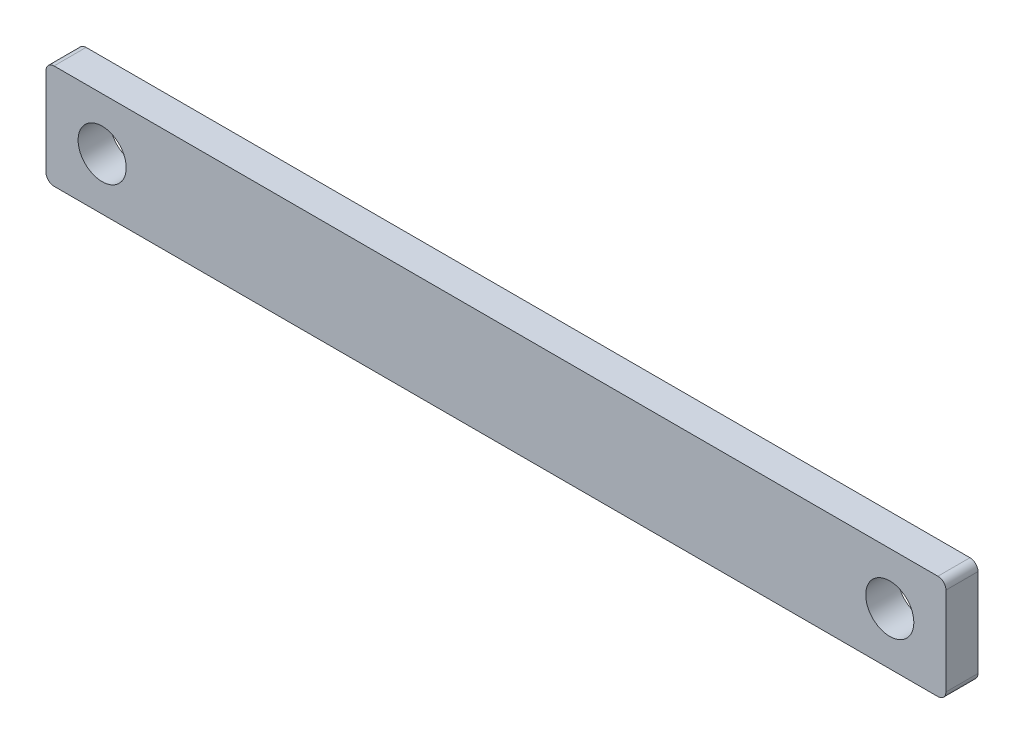
ISO-10303-21;
HEADER;
FILE_DESCRIPTION(('STEP AP214'),'2;1');
FILE_NAME('part.step','',(''),(''),'','','');
FILE_SCHEMA(('AUTOMOTIVE_DESIGN { 1 0 10303 214 1 1 1 1 }'));
ENDSEC;
DATA;
#1=APPLICATION_CONTEXT('core data for automotive mechanical design processes');
#2=APPLICATION_PROTOCOL_DEFINITION('international standard','automotive_design',2000,#1);
#3=PRODUCT_CONTEXT('',#1,'mechanical');
#4=PRODUCT('Part','Part','',(#3));
#5=PRODUCT_RELATED_PRODUCT_CATEGORY('part','',(#4));
#6=PRODUCT_DEFINITION_FORMATION('','',#4);
#7=PRODUCT_DEFINITION_CONTEXT('part definition',#1,'design');
#8=PRODUCT_DEFINITION('design','',#6,#7);
#9=PRODUCT_DEFINITION_SHAPE('','',#8);
#10=(LENGTH_UNIT() NAMED_UNIT(*) SI_UNIT(.MILLI.,.METRE.));
#11=(NAMED_UNIT(*) PLANE_ANGLE_UNIT() SI_UNIT($,.RADIAN.));
#12=(NAMED_UNIT(*) SI_UNIT($,.STERADIAN.) SOLID_ANGLE_UNIT());
#13=UNCERTAINTY_MEASURE_WITH_UNIT(LENGTH_MEASURE(1.E-05),#10,'distance_accuracy_value','');
#14=(GEOMETRIC_REPRESENTATION_CONTEXT(3) GLOBAL_UNCERTAINTY_ASSIGNED_CONTEXT((#13)) GLOBAL_UNIT_ASSIGNED_CONTEXT((#10,
#11,#12)) REPRESENTATION_CONTEXT('',''));
#15=CARTESIAN_POINT('',(0.,0.,0.));
#16=DIRECTION('',(0.,0.,1.));
#17=DIRECTION('',(1.,0.,0.));
#18=AXIS2_PLACEMENT_3D('',#15,#16,#17);
#19=CARTESIAN_POINT('',(1112.,120.,40.));
#20=DIRECTION('',(0.,0.,-1.));
#21=DIRECTION('',(-1.,0.,0.));
#22=AXIS2_PLACEMENT_3D('',#19,#20,#21);
#23=PLANE('',#22);
#24=CARTESIAN_POINT('',(1112.,120.,40.));
#25=DIRECTION('',(0.,0.,1.));
#26=DIRECTION('',(-1.,0.,0.));
#27=AXIS2_PLACEMENT_3D('',#24,#25,#26);
#28=CIRCLE('',#27,9.99999999999989);
#29=CARTESIAN_POINT('',(1122.,120.,40.));
#30=VERTEX_POINT('',#29);
#31=CARTESIAN_POINT('',(1112.,130.,40.));
#32=VERTEX_POINT('',#31);
#33=EDGE_CURVE('E144',#30,#32,#28,.T.);
#34=ORIENTED_EDGE('',*,*,#33,.T.);
#35=DIRECTION('',(-1.,0.,0.));
#36=VECTOR('',#35,1.);
#37=CARTESIAN_POINT('',(10.,130.,40.));
#38=LINE('',#37,#36);
#39=CARTESIAN_POINT('',(10.,130.,40.));
#40=VERTEX_POINT('',#39);
#41=EDGE_CURVE('E92',#32,#40,#38,.T.);
#42=ORIENTED_EDGE('',*,*,#41,.T.);
#43=CARTESIAN_POINT('',(10.,120.,40.));
#44=DIRECTION('',(0.,0.,1.));
#45=DIRECTION('',(-1.,0.,0.));
#46=AXIS2_PLACEMENT_3D('',#43,#44,#45);
#47=CIRCLE('',#46,10.);
#48=CARTESIAN_POINT('',(0.,120.,40.));
#49=VERTEX_POINT('',#48);
#50=EDGE_CURVE('E159',#40,#49,#47,.T.);
#51=ORIENTED_EDGE('',*,*,#50,.T.);
#52=DIRECTION('',(0.,-1.,0.));
#53=VECTOR('',#52,1.);
#54=CARTESIAN_POINT('',(0.,10.0000000000001,40.));
#55=LINE('',#54,#53);
#56=CARTESIAN_POINT('',(0.,10.0000000000001,40.));
#57=VERTEX_POINT('',#56);
#58=EDGE_CURVE('E172',#49,#57,#55,.T.);
#59=ORIENTED_EDGE('',*,*,#58,.T.);
#60=CARTESIAN_POINT('',(10.,10.,40.));
#61=DIRECTION('',(0.,0.,1.));
#62=DIRECTION('',(-1.,0.,0.));
#63=AXIS2_PLACEMENT_3D('',#60,#61,#62);
#64=CIRCLE('',#63,10.);
#65=CARTESIAN_POINT('',(10.0000000000001,0.,40.));
#66=VERTEX_POINT('',#65);
#67=EDGE_CURVE('E111',#57,#66,#64,.T.);
#68=ORIENTED_EDGE('',*,*,#67,.T.);
#69=DIRECTION('',(1.,0.,0.));
#70=VECTOR('',#69,1.);
#71=CARTESIAN_POINT('',(10.0000000000001,0.,40.));
#72=LINE('',#71,#70);
#73=CARTESIAN_POINT('',(1112.,0.,40.));
#74=VERTEX_POINT('',#73);
#75=EDGE_CURVE('E105',#66,#74,#72,.T.);
#76=ORIENTED_EDGE('',*,*,#75,.T.);
#77=CARTESIAN_POINT('',(1112.,10.,40.));
#78=DIRECTION('',(0.,0.,1.));
#79=DIRECTION('',(1.,0.,0.));
#80=AXIS2_PLACEMENT_3D('',#77,#78,#79);
#81=CIRCLE('',#80,10.);
#82=CARTESIAN_POINT('',(1122.,10.,40.));
#83=VERTEX_POINT('',#82);
#84=EDGE_CURVE('E109',#74,#83,#81,.T.);
#85=ORIENTED_EDGE('',*,*,#84,.T.);
#86=DIRECTION('',(0.,1.,0.));
#87=VECTOR('',#86,1.);
#88=CARTESIAN_POINT('',(1122.,10.,40.));
#89=LINE('',#88,#87);
#90=EDGE_CURVE('E49',#83,#30,#89,.T.);
#91=ORIENTED_EDGE('',*,*,#90,.T.);
#92=EDGE_LOOP('',(#34,#42,#51,#59,#68,#76,#85,#91));
#93=FACE_BOUND('',#92,.T.);
#94=CARTESIAN_POINT('',(70.,65.,40.));
#95=DIRECTION('',(0.,0.,1.));
#96=DIRECTION('',(1.,0.,0.));
#97=AXIS2_PLACEMENT_3D('',#94,#95,#96);
#98=CIRCLE('',#97,30.);
#99=CARTESIAN_POINT('',(100.,65.,40.));
#100=VERTEX_POINT('',#99);
#101=EDGE_CURVE('E133',#100,#100,#98,.T.);
#102=ORIENTED_EDGE('',*,*,#101,.F.);
#103=EDGE_LOOP('',(#102));
#104=FACE_BOUND('',#103,.T.);
#105=CARTESIAN_POINT('',(1052.,65.,40.));
#106=DIRECTION('',(0.,0.,1.));
#107=DIRECTION('',(1.,0.,0.));
#108=AXIS2_PLACEMENT_3D('',#105,#106,#107);
#109=CIRCLE('',#108,30.);
#110=CARTESIAN_POINT('',(1082.,65.,40.));
#111=VERTEX_POINT('',#110);
#112=EDGE_CURVE('E181',#111,#111,#109,.T.);
#113=ORIENTED_EDGE('',*,*,#112,.F.);
#114=EDGE_LOOP('',(#113));
#115=FACE_BOUND('',#114,.T.);
#116=ADVANCED_FACE('F32',(#93,#104,#115),#23,.F.);
#117=CARTESIAN_POINT('',(1112.,120.,0.));
#118=DIRECTION('',(0.,0.,-1.));
#119=DIRECTION('',(-1.,0.,0.));
#120=AXIS2_PLACEMENT_3D('',#117,#118,#119);
#121=PLANE('',#120);
#122=CARTESIAN_POINT('',(70.,65.,0.));
#123=DIRECTION('',(0.,0.,1.));
#124=DIRECTION('',(1.,0.,0.));
#125=AXIS2_PLACEMENT_3D('',#122,#123,#124);
#126=CIRCLE('',#125,30.);
#127=CARTESIAN_POINT('',(100.,65.,0.));
#128=VERTEX_POINT('',#127);
#129=EDGE_CURVE('E178',#128,#128,#126,.T.);
#130=ORIENTED_EDGE('',*,*,#129,.T.);
#131=EDGE_LOOP('',(#130));
#132=FACE_BOUND('',#131,.T.);
#133=CARTESIAN_POINT('',(1112.,120.,0.));
#134=DIRECTION('',(0.,0.,1.));
#135=DIRECTION('',(-1.,0.,0.));
#136=AXIS2_PLACEMENT_3D('',#133,#134,#135);
#137=CIRCLE('',#136,9.99999999999989);
#138=CARTESIAN_POINT('',(1122.,120.,0.));
#139=VERTEX_POINT('',#138);
#140=CARTESIAN_POINT('',(1112.,130.,0.));
#141=VERTEX_POINT('',#140);
#142=EDGE_CURVE('E129',#139,#141,#137,.T.);
#143=ORIENTED_EDGE('',*,*,#142,.F.);
#144=DIRECTION('',(0.,1.,0.));
#145=VECTOR('',#144,1.);
#146=CARTESIAN_POINT('',(1122.,10.,0.));
#147=LINE('',#146,#145);
#148=CARTESIAN_POINT('',(1122.,10.,0.));
#149=VERTEX_POINT('',#148);
#150=EDGE_CURVE('E84',#149,#139,#147,.T.);
#151=ORIENTED_EDGE('',*,*,#150,.F.);
#152=CARTESIAN_POINT('',(1112.,10.,0.));
#153=DIRECTION('',(0.,0.,1.));
#154=DIRECTION('',(1.,0.,0.));
#155=AXIS2_PLACEMENT_3D('',#152,#153,#154);
#156=CIRCLE('',#155,10.);
#157=CARTESIAN_POINT('',(1112.,0.,0.));
#158=VERTEX_POINT('',#157);
#159=EDGE_CURVE('E78',#158,#149,#156,.T.);
#160=ORIENTED_EDGE('',*,*,#159,.F.);
#161=DIRECTION('',(1.,0.,0.));
#162=VECTOR('',#161,1.);
#163=CARTESIAN_POINT('',(10.0000000000001,0.,0.));
#164=LINE('',#163,#162);
#165=CARTESIAN_POINT('',(10.0000000000001,0.,0.));
#166=VERTEX_POINT('',#165);
#167=EDGE_CURVE('E119',#166,#158,#164,.T.);
#168=ORIENTED_EDGE('',*,*,#167,.F.);
#169=CARTESIAN_POINT('',(10.,10.,0.));
#170=DIRECTION('',(0.,0.,1.));
#171=DIRECTION('',(-1.,0.,0.));
#172=AXIS2_PLACEMENT_3D('',#169,#170,#171);
#173=CIRCLE('',#172,10.);
#174=CARTESIAN_POINT('',(0.,10.0000000000001,0.));
#175=VERTEX_POINT('',#174);
#176=EDGE_CURVE('E139',#175,#166,#173,.T.);
#177=ORIENTED_EDGE('',*,*,#176,.F.);
#178=DIRECTION('',(0.,-1.,0.));
#179=VECTOR('',#178,1.);
#180=CARTESIAN_POINT('',(0.,10.0000000000001,0.));
#181=LINE('',#180,#179);
#182=CARTESIAN_POINT('',(0.,120.,0.));
#183=VERTEX_POINT('',#182);
#184=EDGE_CURVE('E137',#183,#175,#181,.T.);
#185=ORIENTED_EDGE('',*,*,#184,.F.);
#186=CARTESIAN_POINT('',(10.,120.,0.));
#187=DIRECTION('',(0.,0.,1.));
#188=DIRECTION('',(-1.,0.,0.));
#189=AXIS2_PLACEMENT_3D('',#186,#187,#188);
#190=CIRCLE('',#189,10.);
#191=CARTESIAN_POINT('',(10.,130.,0.));
#192=VERTEX_POINT('',#191);
#193=EDGE_CURVE('E135',#192,#183,#190,.T.);
#194=ORIENTED_EDGE('',*,*,#193,.F.);
#195=DIRECTION('',(-1.,0.,0.));
#196=VECTOR('',#195,1.);
#197=CARTESIAN_POINT('',(10.,130.,0.));
#198=LINE('',#197,#196);
#199=EDGE_CURVE('E132',#141,#192,#198,.T.);
#200=ORIENTED_EDGE('',*,*,#199,.F.);
#201=EDGE_LOOP('',(#143,#151,#160,#168,#177,#185,#194,#200));
#202=FACE_BOUND('',#201,.T.);
#203=CARTESIAN_POINT('',(1052.,65.,0.));
#204=DIRECTION('',(0.,0.,1.));
#205=DIRECTION('',(1.,0.,0.));
#206=AXIS2_PLACEMENT_3D('',#203,#204,#205);
#207=CIRCLE('',#206,30.);
#208=CARTESIAN_POINT('',(1082.,65.,0.));
#209=VERTEX_POINT('',#208);
#210=EDGE_CURVE('E184',#209,#209,#207,.T.);
#211=ORIENTED_EDGE('',*,*,#210,.T.);
#212=EDGE_LOOP('',(#211));
#213=FACE_BOUND('',#212,.T.);
#214=ADVANCED_FACE('F163',(#132,#202,#213),#121,.T.);
#215=CARTESIAN_POINT('',(1112.,120.,40.));
#216=DIRECTION('',(0.,0.,-1.));
#217=DIRECTION('',(-1.,0.,0.));
#218=AXIS2_PLACEMENT_3D('',#215,#216,#217);
#219=CYLINDRICAL_SURFACE('',#218,9.99999999999989);
#220=ORIENTED_EDGE('',*,*,#142,.T.);
#221=DIRECTION('',(0.,0.,-1.));
#222=VECTOR('',#221,1.);
#223=CARTESIAN_POINT('',(1112.,130.,40.));
#224=LINE('',#223,#222);
#225=EDGE_CURVE('E11',#32,#141,#224,.T.);
#226=ORIENTED_EDGE('',*,*,#225,.F.);
#227=ORIENTED_EDGE('',*,*,#33,.F.);
#228=DIRECTION('',(0.,0.,-1.));
#229=VECTOR('',#228,1.);
#230=CARTESIAN_POINT('',(1122.,120.,40.));
#231=LINE('',#230,#229);
#232=EDGE_CURVE('E125',#30,#139,#231,.T.);
#233=ORIENTED_EDGE('',*,*,#232,.T.);
#234=EDGE_LOOP('',(#220,#226,#227,#233));
#235=FACE_BOUND('',#234,.T.);
#236=ADVANCED_FACE('F34',(#235),#219,.T.);
#237=CARTESIAN_POINT('',(10.,130.,40.));
#238=DIRECTION('',(0.,-1.,0.));
#239=DIRECTION('',(0.,0.,-1.));
#240=AXIS2_PLACEMENT_3D('',#237,#238,#239);
#241=PLANE('',#240);
#242=ORIENTED_EDGE('',*,*,#199,.T.);
#243=DIRECTION('',(0.,0.,-1.));
#244=VECTOR('',#243,1.);
#245=CARTESIAN_POINT('',(10.,130.,40.));
#246=LINE('',#245,#244);
#247=EDGE_CURVE('E41',#40,#192,#246,.T.);
#248=ORIENTED_EDGE('',*,*,#247,.F.);
#249=ORIENTED_EDGE('',*,*,#41,.F.);
#250=ORIENTED_EDGE('',*,*,#225,.T.);
#251=EDGE_LOOP('',(#242,#248,#249,#250));
#252=FACE_BOUND('',#251,.T.);
#253=ADVANCED_FACE('F216',(#252),#241,.F.);
#254=CARTESIAN_POINT('',(10.,120.,40.));
#255=DIRECTION('',(0.,0.,-1.));
#256=DIRECTION('',(-1.,0.,0.));
#257=AXIS2_PLACEMENT_3D('',#254,#255,#256);
#258=CYLINDRICAL_SURFACE('',#257,10.);
#259=ORIENTED_EDGE('',*,*,#193,.T.);
#260=DIRECTION('',(0.,0.,-1.));
#261=VECTOR('',#260,1.);
#262=CARTESIAN_POINT('',(0.,120.,40.));
#263=LINE('',#262,#261);
#264=EDGE_CURVE('E151',#49,#183,#263,.T.);
#265=ORIENTED_EDGE('',*,*,#264,.F.);
#266=ORIENTED_EDGE('',*,*,#50,.F.);
#267=ORIENTED_EDGE('',*,*,#247,.T.);
#268=EDGE_LOOP('',(#259,#265,#266,#267));
#269=FACE_BOUND('',#268,.T.);
#270=ADVANCED_FACE('F157',(#269),#258,.T.);
#271=CARTESIAN_POINT('',(0.,10.0000000000001,40.));
#272=DIRECTION('',(1.,0.,0.));
#273=DIRECTION('',(0.,0.,-1.));
#274=AXIS2_PLACEMENT_3D('',#271,#272,#273);
#275=PLANE('',#274);
#276=ORIENTED_EDGE('',*,*,#184,.T.);
#277=DIRECTION('',(0.,0.,-1.));
#278=VECTOR('',#277,1.);
#279=CARTESIAN_POINT('',(0.,10.0000000000001,40.));
#280=LINE('',#279,#278);
#281=EDGE_CURVE('E148',#57,#175,#280,.T.);
#282=ORIENTED_EDGE('',*,*,#281,.F.);
#283=ORIENTED_EDGE('',*,*,#58,.F.);
#284=ORIENTED_EDGE('',*,*,#264,.T.);
#285=EDGE_LOOP('',(#276,#282,#283,#284));
#286=FACE_BOUND('',#285,.T.);
#287=ADVANCED_FACE('F168',(#286),#275,.F.);
#288=CARTESIAN_POINT('',(10.,10.,40.));
#289=DIRECTION('',(0.,0.,-1.));
#290=DIRECTION('',(-1.,0.,0.));
#291=AXIS2_PLACEMENT_3D('',#288,#289,#290);
#292=CYLINDRICAL_SURFACE('',#291,10.);
#293=ORIENTED_EDGE('',*,*,#176,.T.);
#294=DIRECTION('',(0.,0.,-1.));
#295=VECTOR('',#294,1.);
#296=CARTESIAN_POINT('',(10.0000000000001,0.,40.));
#297=LINE('',#296,#295);
#298=EDGE_CURVE('E120',#66,#166,#297,.T.);
#299=ORIENTED_EDGE('',*,*,#298,.F.);
#300=ORIENTED_EDGE('',*,*,#67,.F.);
#301=ORIENTED_EDGE('',*,*,#281,.T.);
#302=EDGE_LOOP('',(#293,#299,#300,#301));
#303=FACE_BOUND('',#302,.T.);
#304=ADVANCED_FACE('F171',(#303),#292,.T.);
#305=CARTESIAN_POINT('',(10.0000000000001,0.,40.));
#306=DIRECTION('',(0.,1.,0.));
#307=DIRECTION('',(0.,0.,1.));
#308=AXIS2_PLACEMENT_3D('',#305,#306,#307);
#309=PLANE('',#308);
#310=ORIENTED_EDGE('',*,*,#167,.T.);
#311=DIRECTION('',(0.,0.,-1.));
#312=VECTOR('',#311,1.);
#313=CARTESIAN_POINT('',(1112.,0.,40.));
#314=LINE('',#313,#312);
#315=EDGE_CURVE('E116',#74,#158,#314,.T.);
#316=ORIENTED_EDGE('',*,*,#315,.F.);
#317=ORIENTED_EDGE('',*,*,#75,.F.);
#318=ORIENTED_EDGE('',*,*,#298,.T.);
#319=EDGE_LOOP('',(#310,#316,#317,#318));
#320=FACE_BOUND('',#319,.T.);
#321=ADVANCED_FACE('F117',(#320),#309,.F.);
#322=CARTESIAN_POINT('',(1112.,10.,40.));
#323=DIRECTION('',(0.,0.,-1.));
#324=DIRECTION('',(-1.,0.,0.));
#325=AXIS2_PLACEMENT_3D('',#322,#323,#324);
#326=CYLINDRICAL_SURFACE('',#325,10.);
#327=ORIENTED_EDGE('',*,*,#159,.T.);
#328=DIRECTION('',(0.,0.,-1.));
#329=VECTOR('',#328,1.);
#330=CARTESIAN_POINT('',(1122.,10.,40.));
#331=LINE('',#330,#329);
#332=EDGE_CURVE('E121',#83,#149,#331,.T.);
#333=ORIENTED_EDGE('',*,*,#332,.F.);
#334=ORIENTED_EDGE('',*,*,#84,.F.);
#335=ORIENTED_EDGE('',*,*,#315,.T.);
#336=EDGE_LOOP('',(#327,#333,#334,#335));
#337=FACE_BOUND('',#336,.T.);
#338=ADVANCED_FACE('F123',(#337),#326,.T.);
#339=CARTESIAN_POINT('',(1122.,10.,40.));
#340=DIRECTION('',(-1.,0.,0.));
#341=DIRECTION('',(0.,-1.,0.));
#342=AXIS2_PLACEMENT_3D('',#339,#340,#341);
#343=PLANE('',#342);
#344=ORIENTED_EDGE('',*,*,#150,.T.);
#345=ORIENTED_EDGE('',*,*,#232,.F.);
#346=ORIENTED_EDGE('',*,*,#90,.F.);
#347=ORIENTED_EDGE('',*,*,#332,.T.);
#348=EDGE_LOOP('',(#344,#345,#346,#347));
#349=FACE_BOUND('',#348,.T.);
#350=ADVANCED_FACE('F204',(#349),#343,.F.);
#351=CARTESIAN_POINT('',(70.,65.,40.));
#352=DIRECTION('',(0.,0.,-1.));
#353=DIRECTION('',(-1.,0.,0.));
#354=AXIS2_PLACEMENT_3D('',#351,#352,#353);
#355=CYLINDRICAL_SURFACE('',#354,30.);
#356=ORIENTED_EDGE('',*,*,#101,.T.);
#357=EDGE_LOOP('',(#356));
#358=FACE_BOUND('',#357,.T.);
#359=ORIENTED_EDGE('',*,*,#129,.F.);
#360=EDGE_LOOP('',(#359));
#361=FACE_BOUND('',#360,.T.);
#362=ADVANCED_FACE('F201',(#358,#361),#355,.F.);
#363=CARTESIAN_POINT('',(1052.,65.,40.));
#364=DIRECTION('',(0.,0.,-1.));
#365=DIRECTION('',(-1.,0.,0.));
#366=AXIS2_PLACEMENT_3D('',#363,#364,#365);
#367=CYLINDRICAL_SURFACE('',#366,30.);
#368=ORIENTED_EDGE('',*,*,#112,.T.);
#369=EDGE_LOOP('',(#368));
#370=FACE_BOUND('',#369,.T.);
#371=ORIENTED_EDGE('',*,*,#210,.F.);
#372=EDGE_LOOP('',(#371));
#373=FACE_BOUND('',#372,.T.);
#374=ADVANCED_FACE('F190',(#370,#373),#367,.F.);
#375=CLOSED_SHELL('',(#116,#214,#236,#253,#270,#287,#304,#321,#338,#350,#362,#374));
#376=MANIFOLD_SOLID_BREP('B2',#375);
#377=ADVANCED_BREP_SHAPE_REPRESENTATION('',(#18,#376),#14);
#378=SHAPE_DEFINITION_REPRESENTATION(#9,#377);
ENDSEC;
END-ISO-10303-21;
